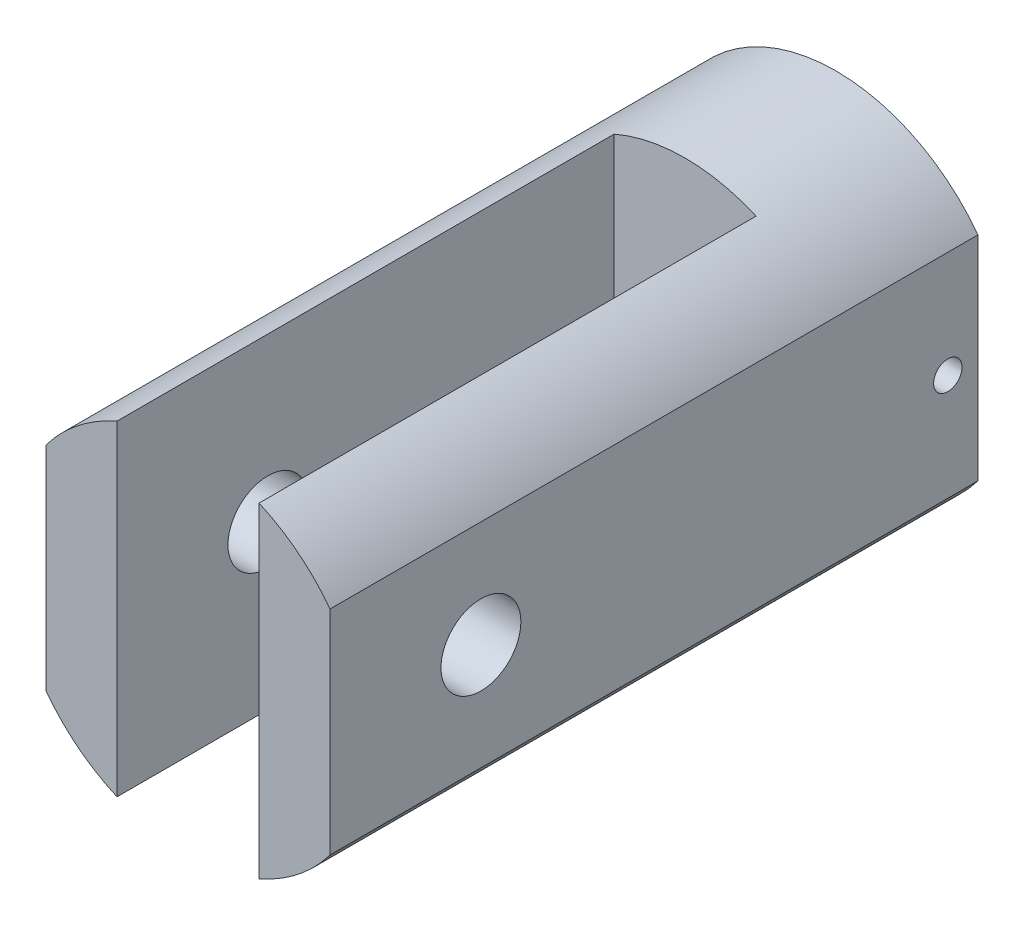
ISO-10303-21;
HEADER;
FILE_DESCRIPTION(('STEP AP214'),'2;1');
FILE_NAME('part.step','',(''),(''),'','','');
FILE_SCHEMA(('AUTOMOTIVE_DESIGN { 1 0 10303 214 1 1 1 1 }'));
ENDSEC;
DATA;
#1=APPLICATION_CONTEXT('core data for automotive mechanical design processes');
#2=APPLICATION_PROTOCOL_DEFINITION('international standard','automotive_design',2000,#1);
#3=PRODUCT_CONTEXT('',#1,'mechanical');
#4=PRODUCT('Part','Part','',(#3));
#5=PRODUCT_RELATED_PRODUCT_CATEGORY('part','',(#4));
#6=PRODUCT_DEFINITION_FORMATION('','',#4);
#7=PRODUCT_DEFINITION_CONTEXT('part definition',#1,'design');
#8=PRODUCT_DEFINITION('design','',#6,#7);
#9=PRODUCT_DEFINITION_SHAPE('','',#8);
#10=(LENGTH_UNIT() NAMED_UNIT(*) SI_UNIT(.MILLI.,.METRE.));
#11=(NAMED_UNIT(*) PLANE_ANGLE_UNIT() SI_UNIT($,.RADIAN.));
#12=(NAMED_UNIT(*) SI_UNIT($,.STERADIAN.) SOLID_ANGLE_UNIT());
#13=UNCERTAINTY_MEASURE_WITH_UNIT(LENGTH_MEASURE(1.E-05),#10,'distance_accuracy_value','');
#14=(GEOMETRIC_REPRESENTATION_CONTEXT(3) GLOBAL_UNCERTAINTY_ASSIGNED_CONTEXT((#13)) GLOBAL_UNIT_ASSIGNED_CONTEXT((#10,
#11,#12)) REPRESENTATION_CONTEXT('',''));
#15=CARTESIAN_POINT('',(0.,0.,0.));
#16=DIRECTION('',(0.,0.,1.));
#17=DIRECTION('',(1.,0.,0.));
#18=AXIS2_PLACEMENT_3D('',#15,#16,#17);
#19=CARTESIAN_POINT('',(0.,0.,36.5));
#20=DIRECTION('',(0.,0.,-1.));
#21=DIRECTION('',(-1.,0.,0.));
#22=AXIS2_PLACEMENT_3D('',#19,#20,#21);
#23=CYLINDRICAL_SURFACE('',#22,10.);
#24=CARTESIAN_POINT('',(0.,0.,36.5));
#25=DIRECTION('',(0.,0.,1.));
#26=DIRECTION('',(1.,0.,0.));
#27=AXIS2_PLACEMENT_3D('',#24,#25,#26);
#28=CIRCLE('',#27,10.);
#29=CARTESIAN_POINT('',(8.00000000000001,5.99999999999999,36.5));
#30=VERTEX_POINT('',#29);
#31=CARTESIAN_POINT('',(4.,9.16515138991168,36.5));
#32=VERTEX_POINT('',#31);
#33=EDGE_CURVE('E127',#30,#32,#28,.T.);
#34=ORIENTED_EDGE('',*,*,#33,.F.);
#35=DIRECTION('',(0.,0.,-1.));
#36=VECTOR('',#35,1.);
#37=CARTESIAN_POINT('',(8.00000000000001,5.99999999999999,36.5));
#38=LINE('',#37,#36);
#39=CARTESIAN_POINT('',(8.,6.,0.));
#40=VERTEX_POINT('',#39);
#41=EDGE_CURVE('E107',#30,#40,#38,.T.);
#42=ORIENTED_EDGE('',*,*,#41,.T.);
#43=CARTESIAN_POINT('',(0.,0.,0.));
#44=DIRECTION('',(0.,0.,1.));
#45=DIRECTION('',(1.,0.,0.));
#46=AXIS2_PLACEMENT_3D('',#43,#44,#45);
#47=CIRCLE('',#46,10.);
#48=CARTESIAN_POINT('',(-8.,6.,0.));
#49=VERTEX_POINT('',#48);
#50=EDGE_CURVE('E63',#40,#49,#47,.T.);
#51=ORIENTED_EDGE('',*,*,#50,.T.);
#52=DIRECTION('',(0.,0.,-1.));
#53=VECTOR('',#52,1.);
#54=CARTESIAN_POINT('',(-8.,6.00000000000001,36.5));
#55=LINE('',#54,#53);
#56=CARTESIAN_POINT('',(-8.,6.00000000000001,36.5));
#57=VERTEX_POINT('',#56);
#58=EDGE_CURVE('E232',#49,#57,#55,.F.);
#59=ORIENTED_EDGE('',*,*,#58,.T.);
#60=CARTESIAN_POINT('',(-4.,9.16515138991168,36.5));
#61=VERTEX_POINT('',#60);
#62=EDGE_CURVE('E129',#61,#57,#28,.T.);
#63=ORIENTED_EDGE('',*,*,#62,.F.);
#64=DIRECTION('',(0.,0.,-1.));
#65=VECTOR('',#64,1.);
#66=CARTESIAN_POINT('',(-4.,9.16515138991168,36.5));
#67=LINE('',#66,#65);
#68=CARTESIAN_POINT('',(-4.,9.16515138991168,8.5));
#69=VERTEX_POINT('',#68);
#70=EDGE_CURVE('E244',#61,#69,#67,.T.);
#71=ORIENTED_EDGE('',*,*,#70,.T.);
#72=CARTESIAN_POINT('',(0.,0.,8.5));
#73=DIRECTION('',(0.,0.,-1.));
#74=DIRECTION('',(-1.,0.,0.));
#75=AXIS2_PLACEMENT_3D('',#72,#73,#74);
#76=CIRCLE('',#75,10.);
#77=CARTESIAN_POINT('',(4.,9.16515138991168,8.49999999999999));
#78=VERTEX_POINT('',#77);
#79=EDGE_CURVE('E142',#69,#78,#76,.T.);
#80=ORIENTED_EDGE('',*,*,#79,.T.);
#81=DIRECTION('',(0.,0.,-1.));
#82=VECTOR('',#81,1.);
#83=CARTESIAN_POINT('',(4.,9.16515138991168,36.5));
#84=LINE('',#83,#82);
#85=EDGE_CURVE('E247',#78,#32,#84,.F.);
#86=ORIENTED_EDGE('',*,*,#85,.T.);
#87=EDGE_LOOP('',(#34,#42,#51,#59,#63,#71,#80,#86));
#88=FACE_BOUND('',#87,.T.);
#89=ADVANCED_FACE('F35',(#88),#23,.T.);
#90=CARTESIAN_POINT('',(0.,0.,36.5));
#91=DIRECTION('',(0.,0.,1.));
#92=DIRECTION('',(1.,0.,0.));
#93=AXIS2_PLACEMENT_3D('',#90,#91,#92);
#94=PLANE('',#93);
#95=DIRECTION('',(0.,1.,0.));
#96=VECTOR('',#95,1.);
#97=CARTESIAN_POINT('',(8.00000000000001,-10.,36.5));
#98=LINE('',#97,#96);
#99=CARTESIAN_POINT('',(8.00000000000001,-5.99999999999999,36.5));
#100=VERTEX_POINT('',#99);
#101=EDGE_CURVE('E105',#100,#30,#98,.T.);
#102=ORIENTED_EDGE('',*,*,#101,.T.);
#103=ORIENTED_EDGE('',*,*,#33,.T.);
#104=DIRECTION('',(0.,1.,0.));
#105=VECTOR('',#104,1.);
#106=CARTESIAN_POINT('',(4.,0.,36.5));
#107=LINE('',#106,#105);
#108=CARTESIAN_POINT('',(4.,-9.16515138991168,36.5));
#109=VERTEX_POINT('',#108);
#110=EDGE_CURVE('E125',#109,#32,#107,.T.);
#111=ORIENTED_EDGE('',*,*,#110,.F.);
#112=EDGE_CURVE('E117',#109,#100,#28,.T.);
#113=ORIENTED_EDGE('',*,*,#112,.T.);
#114=EDGE_LOOP('',(#102,#103,#111,#113));
#115=FACE_BOUND('',#114,.T.);
#116=ADVANCED_FACE('F123',(#115),#94,.T.);
#117=CARTESIAN_POINT('',(-8.,-6.,0.));
#118=VERTEX_POINT('',#117);
#119=CARTESIAN_POINT('',(8.,-6.,0.));
#120=VERTEX_POINT('',#119);
#121=EDGE_CURVE('E120',#118,#120,#47,.T.);
#122=ORIENTED_EDGE('',*,*,#121,.T.);
#123=DIRECTION('',(0.,0.,-1.));
#124=VECTOR('',#123,1.);
#125=CARTESIAN_POINT('',(8.00000000000001,-5.99999999999999,36.5));
#126=LINE('',#125,#124);
#127=EDGE_CURVE('E56',#120,#100,#126,.F.);
#128=ORIENTED_EDGE('',*,*,#127,.T.);
#129=ORIENTED_EDGE('',*,*,#112,.F.);
#130=DIRECTION('',(0.,0.,-1.));
#131=VECTOR('',#130,1.);
#132=CARTESIAN_POINT('',(4.,-9.16515138991168,36.5));
#133=LINE('',#132,#131);
#134=CARTESIAN_POINT('',(4.,-9.16515138991168,8.49999999999999));
#135=VERTEX_POINT('',#134);
#136=EDGE_CURVE('E249',#109,#135,#133,.T.);
#137=ORIENTED_EDGE('',*,*,#136,.T.);
#138=CARTESIAN_POINT('',(-4.,-9.16515138991168,8.5));
#139=VERTEX_POINT('',#138);
#140=EDGE_CURVE('E147',#135,#139,#76,.T.);
#141=ORIENTED_EDGE('',*,*,#140,.T.);
#142=DIRECTION('',(0.,0.,-1.));
#143=VECTOR('',#142,1.);
#144=CARTESIAN_POINT('',(-4.,-9.16515138991168,36.5));
#145=LINE('',#144,#143);
#146=CARTESIAN_POINT('',(-4.,-9.16515138991168,36.5));
#147=VERTEX_POINT('',#146);
#148=EDGE_CURVE('E240',#139,#147,#145,.F.);
#149=ORIENTED_EDGE('',*,*,#148,.T.);
#150=CARTESIAN_POINT('',(-8.,-6.00000000000001,36.5));
#151=VERTEX_POINT('',#150);
#152=EDGE_CURVE('E126',#151,#147,#28,.T.);
#153=ORIENTED_EDGE('',*,*,#152,.F.);
#154=DIRECTION('',(0.,0.,-1.));
#155=VECTOR('',#154,1.);
#156=CARTESIAN_POINT('',(-8.,-6.00000000000001,36.5));
#157=LINE('',#156,#155);
#158=EDGE_CURVE('E234',#151,#118,#157,.T.);
#159=ORIENTED_EDGE('',*,*,#158,.T.);
#160=EDGE_LOOP('',(#122,#128,#129,#137,#141,#149,#153,#159));
#161=FACE_BOUND('',#160,.T.);
#162=ADVANCED_FACE('F37',(#161),#23,.T.);
#163=DIRECTION('',(0.,1.,0.));
#164=VECTOR('',#163,1.);
#165=CARTESIAN_POINT('',(-8.,-10.,36.5));
#166=LINE('',#165,#164);
#167=EDGE_CURVE('E230',#151,#57,#166,.T.);
#168=ORIENTED_EDGE('',*,*,#167,.F.);
#169=ORIENTED_EDGE('',*,*,#152,.T.);
#170=DIRECTION('',(0.,-1.,0.));
#171=VECTOR('',#170,1.);
#172=CARTESIAN_POINT('',(-4.,0.,36.5));
#173=LINE('',#172,#171);
#174=EDGE_CURVE('E133',#61,#147,#173,.T.);
#175=ORIENTED_EDGE('',*,*,#174,.F.);
#176=ORIENTED_EDGE('',*,*,#62,.T.);
#177=EDGE_LOOP('',(#168,#169,#175,#176));
#178=FACE_BOUND('',#177,.T.);
#179=ADVANCED_FACE('F180',(#178),#94,.T.);
#180=CARTESIAN_POINT('',(0.,0.,0.));
#181=DIRECTION('',(0.,0.,1.));
#182=DIRECTION('',(1.,0.,0.));
#183=AXIS2_PLACEMENT_3D('',#180,#181,#182);
#184=PLANE('',#183);
#185=CARTESIAN_POINT('',(0.,0.,0.));
#186=DIRECTION('',(0.,0.,-1.));
#187=DIRECTION('',(-1.,0.,0.));
#188=AXIS2_PLACEMENT_3D('',#185,#186,#187);
#189=CIRCLE('',#188,2.85);
#190=CARTESIAN_POINT('',(-2.85,0.,0.));
#191=VERTEX_POINT('',#190);
#192=EDGE_CURVE('E261',#191,#191,#189,.T.);
#193=ORIENTED_EDGE('',*,*,#192,.F.);
#194=EDGE_LOOP('',(#193));
#195=FACE_BOUND('',#194,.T.);
#196=ORIENTED_EDGE('',*,*,#50,.F.);
#197=DIRECTION('',(0.,-1.,0.));
#198=VECTOR('',#197,1.);
#199=CARTESIAN_POINT('',(8.,0.,0.));
#200=LINE('',#199,#198);
#201=EDGE_CURVE('E11',#40,#120,#200,.T.);
#202=ORIENTED_EDGE('',*,*,#201,.T.);
#203=ORIENTED_EDGE('',*,*,#121,.F.);
#204=DIRECTION('',(0.,1.,0.));
#205=VECTOR('',#204,1.);
#206=CARTESIAN_POINT('',(-8.,0.,0.));
#207=LINE('',#206,#205);
#208=EDGE_CURVE('E48',#118,#49,#207,.T.);
#209=ORIENTED_EDGE('',*,*,#208,.T.);
#210=EDGE_LOOP('',(#196,#202,#203,#209));
#211=FACE_BOUND('',#210,.T.);
#212=ADVANCED_FACE('F185',(#195,#211),#184,.F.);
#213=CARTESIAN_POINT('',(-4.,-10.,8.5));
#214=DIRECTION('',(0.,0.,-1.));
#215=DIRECTION('',(-1.,0.,0.));
#216=AXIS2_PLACEMENT_3D('',#213,#214,#215);
#217=PLANE('',#216);
#218=DIRECTION('',(0.,1.,0.));
#219=VECTOR('',#218,1.);
#220=CARTESIAN_POINT('',(-4.,-10.,8.5));
#221=LINE('',#220,#219);
#222=EDGE_CURVE('E237',#139,#69,#221,.T.);
#223=ORIENTED_EDGE('',*,*,#222,.F.);
#224=ORIENTED_EDGE('',*,*,#140,.F.);
#225=DIRECTION('',(0.,1.,0.));
#226=VECTOR('',#225,1.);
#227=CARTESIAN_POINT('',(4.,-10.,8.49999999999999));
#228=LINE('',#227,#226);
#229=EDGE_CURVE('E236',#135,#78,#228,.T.);
#230=ORIENTED_EDGE('',*,*,#229,.T.);
#231=ORIENTED_EDGE('',*,*,#79,.F.);
#232=EDGE_LOOP('',(#223,#224,#230,#231));
#233=FACE_BOUND('',#232,.T.);
#234=ADVANCED_FACE('F189',(#233),#217,.F.);
#235=CARTESIAN_POINT('',(4.,-10.,8.49999999999999));
#236=DIRECTION('',(1.,0.,0.));
#237=DIRECTION('',(0.,0.,-1.));
#238=AXIS2_PLACEMENT_3D('',#235,#236,#237);
#239=PLANE('',#238);
#240=CARTESIAN_POINT('',(4.,0.,28.));
#241=DIRECTION('',(1.,0.,0.));
#242=DIRECTION('',(0.,0.,-1.));
#243=AXIS2_PLACEMENT_3D('',#240,#241,#242);
#244=CIRCLE('',#243,2.25);
#245=CARTESIAN_POINT('',(4.,0.,25.75));
#246=VERTEX_POINT('',#245);
#247=EDGE_CURVE('E111',#246,#246,#244,.T.);
#248=ORIENTED_EDGE('',*,*,#247,.T.);
#249=EDGE_LOOP('',(#248));
#250=FACE_BOUND('',#249,.T.);
#251=ORIENTED_EDGE('',*,*,#110,.T.);
#252=ORIENTED_EDGE('',*,*,#85,.F.);
#253=ORIENTED_EDGE('',*,*,#229,.F.);
#254=ORIENTED_EDGE('',*,*,#136,.F.);
#255=EDGE_LOOP('',(#251,#252,#253,#254));
#256=FACE_BOUND('',#255,.T.);
#257=ADVANCED_FACE('F192',(#250,#256),#239,.F.);
#258=CARTESIAN_POINT('',(-4.,-10.,8.5));
#259=DIRECTION('',(-1.,0.,0.));
#260=DIRECTION('',(0.,0.,1.));
#261=AXIS2_PLACEMENT_3D('',#258,#259,#260);
#262=PLANE('',#261);
#263=CARTESIAN_POINT('',(-4.,0.,28.));
#264=DIRECTION('',(-1.,0.,0.));
#265=DIRECTION('',(0.,0.,1.));
#266=AXIS2_PLACEMENT_3D('',#263,#264,#265);
#267=CIRCLE('',#266,2.25);
#268=CARTESIAN_POINT('',(-4.,0.,30.25));
#269=VERTEX_POINT('',#268);
#270=EDGE_CURVE('E222',#269,#269,#267,.T.);
#271=ORIENTED_EDGE('',*,*,#270,.T.);
#272=EDGE_LOOP('',(#271));
#273=FACE_BOUND('',#272,.T.);
#274=ORIENTED_EDGE('',*,*,#174,.T.);
#275=ORIENTED_EDGE('',*,*,#148,.F.);
#276=ORIENTED_EDGE('',*,*,#222,.T.);
#277=ORIENTED_EDGE('',*,*,#70,.F.);
#278=EDGE_LOOP('',(#274,#275,#276,#277));
#279=FACE_BOUND('',#278,.T.);
#280=ADVANCED_FACE('F195',(#273,#279),#262,.F.);
#281=CARTESIAN_POINT('',(-8.,-10.,0.));
#282=DIRECTION('',(1.,0.,0.));
#283=DIRECTION('',(0.,0.,-1.));
#284=AXIS2_PLACEMENT_3D('',#281,#282,#283);
#285=PLANE('',#284);
#286=CARTESIAN_POINT('',(-8.,0.,1.7));
#287=DIRECTION('',(-1.,0.,0.));
#288=DIRECTION('',(0.,0.,1.));
#289=AXIS2_PLACEMENT_3D('',#286,#287,#288);
#290=CIRCLE('',#289,0.8);
#291=CARTESIAN_POINT('',(-8.,0.,2.5));
#292=VERTEX_POINT('',#291);
#293=EDGE_CURVE('E265',#292,#292,#290,.T.);
#294=ORIENTED_EDGE('',*,*,#293,.F.);
#295=EDGE_LOOP('',(#294));
#296=FACE_BOUND('',#295,.T.);
#297=CARTESIAN_POINT('',(-8.,0.,28.));
#298=DIRECTION('',(1.,0.,0.));
#299=DIRECTION('',(0.,0.,-1.));
#300=AXIS2_PLACEMENT_3D('',#297,#298,#299);
#301=CIRCLE('',#300,2.25);
#302=CARTESIAN_POINT('',(-8.,0.,25.75));
#303=VERTEX_POINT('',#302);
#304=EDGE_CURVE('E225',#303,#303,#301,.T.);
#305=ORIENTED_EDGE('',*,*,#304,.T.);
#306=EDGE_LOOP('',(#305));
#307=FACE_BOUND('',#306,.T.);
#308=ORIENTED_EDGE('',*,*,#167,.T.);
#309=ORIENTED_EDGE('',*,*,#58,.F.);
#310=ORIENTED_EDGE('',*,*,#208,.F.);
#311=ORIENTED_EDGE('',*,*,#158,.F.);
#312=EDGE_LOOP('',(#308,#309,#310,#311));
#313=FACE_BOUND('',#312,.T.);
#314=ADVANCED_FACE('F202',(#296,#307,#313),#285,.F.);
#315=CARTESIAN_POINT('',(8.,-10.,0.));
#316=DIRECTION('',(-1.,0.,0.));
#317=DIRECTION('',(0.,0.,1.));
#318=AXIS2_PLACEMENT_3D('',#315,#316,#317);
#319=PLANE('',#318);
#320=CARTESIAN_POINT('',(8.00000000000001,0.,1.7));
#321=DIRECTION('',(-1.,0.,0.));
#322=DIRECTION('',(0.,0.,1.));
#323=AXIS2_PLACEMENT_3D('',#320,#321,#322);
#324=CIRCLE('',#323,0.8);
#325=CARTESIAN_POINT('',(8.00000000000001,0.,2.5));
#326=VERTEX_POINT('',#325);
#327=EDGE_CURVE('E153',#326,#326,#324,.T.);
#328=ORIENTED_EDGE('',*,*,#327,.T.);
#329=EDGE_LOOP('',(#328));
#330=FACE_BOUND('',#329,.T.);
#331=CARTESIAN_POINT('',(8.00000000000001,0.,28.));
#332=DIRECTION('',(1.,0.,0.));
#333=DIRECTION('',(0.,0.,-1.));
#334=AXIS2_PLACEMENT_3D('',#331,#332,#333);
#335=CIRCLE('',#334,2.25);
#336=CARTESIAN_POINT('',(8.00000000000001,0.,25.75));
#337=VERTEX_POINT('',#336);
#338=EDGE_CURVE('E219',#337,#337,#335,.T.);
#339=ORIENTED_EDGE('',*,*,#338,.F.);
#340=EDGE_LOOP('',(#339));
#341=FACE_BOUND('',#340,.T.);
#342=ORIENTED_EDGE('',*,*,#101,.F.);
#343=ORIENTED_EDGE('',*,*,#127,.F.);
#344=ORIENTED_EDGE('',*,*,#201,.F.);
#345=ORIENTED_EDGE('',*,*,#41,.F.);
#346=EDGE_LOOP('',(#342,#343,#344,#345));
#347=FACE_BOUND('',#346,.T.);
#348=ADVANCED_FACE('F106',(#330,#341,#347),#319,.F.);
#349=CARTESIAN_POINT('',(-8.,0.,28.));
#350=DIRECTION('',(1.,0.,0.));
#351=DIRECTION('',(0.,0.,-1.));
#352=AXIS2_PLACEMENT_3D('',#349,#350,#351);
#353=CYLINDRICAL_SURFACE('',#352,2.25);
#354=ORIENTED_EDGE('',*,*,#338,.T.);
#355=EDGE_LOOP('',(#354));
#356=FACE_BOUND('',#355,.T.);
#357=ORIENTED_EDGE('',*,*,#247,.F.);
#358=EDGE_LOOP('',(#357));
#359=FACE_BOUND('',#358,.T.);
#360=ADVANCED_FACE('F208',(#356,#359),#353,.F.);
#361=ORIENTED_EDGE('',*,*,#304,.F.);
#362=EDGE_LOOP('',(#361));
#363=FACE_BOUND('',#362,.T.);
#364=ORIENTED_EDGE('',*,*,#270,.F.);
#365=EDGE_LOOP('',(#364));
#366=FACE_BOUND('',#365,.T.);
#367=ADVANCED_FACE('F172',(#363,#366),#353,.F.);
#368=CARTESIAN_POINT('',(0.,0.,3.8));
#369=DIRECTION('',(0.,0.,-1.));
#370=DIRECTION('',(-1.,0.,0.));
#371=AXIS2_PLACEMENT_3D('',#368,#369,#370);
#372=CYLINDRICAL_SURFACE('',#371,2.85);
#373=CARTESIAN_POINT('',(-2.85,0.,2.5));
#374=CARTESIAN_POINT('',(-2.84999943440691,0.0440142185350792,2.4999991472256));
#375=CARTESIAN_POINT('',(-2.84897047471691,0.0880372914127955,2.49635552422548));
#376=CARTESIAN_POINT('',(-2.84496590767905,0.17480957599527,2.48190666105973));
#377=CARTESIAN_POINT('',(-2.84198951007227,0.217558263195526,2.47109851354864));
#378=CARTESIAN_POINT('',(-2.83441761738066,0.300517139775411,2.44270394378503));
#379=CARTESIAN_POINT('',(-2.829824335115,0.340730710394852,2.42512678232395));
#380=CARTESIAN_POINT('',(-2.81950080548073,0.417639552962544,2.38372897460041));
#381=CARTESIAN_POINT('',(-2.81377045054328,0.454334491555271,2.35990773757029));
#382=CARTESIAN_POINT('',(-2.80162528783942,0.524098648568391,2.30605813197358));
#383=CARTESIAN_POINT('',(-2.7951978079715,0.557065554721843,2.27590007354776));
#384=CARTESIAN_POINT('',(-2.78246177086238,0.617546561457283,2.21050978310805));
#385=CARTESIAN_POINT('',(-2.77615323086643,0.645059876734844,2.17527682157933));
#386=CARTESIAN_POINT('',(-2.76423796230357,0.694367516303863,2.09990028850307));
#387=CARTESIAN_POINT('',(-2.75864712709805,0.716041226159381,2.0596750716191));
#388=CARTESIAN_POINT('',(-2.74898787558308,0.752276409636693,1.97596894893513));
#389=CARTESIAN_POINT('',(-2.74491914455181,0.766839353724722,1.93248871840032));
#390=CARTESIAN_POINT('',(-2.73889611368771,0.788078724404868,1.84464662355717));
#391=CARTESIAN_POINT('',(-2.7368918308357,0.794941957977528,1.80033344142513));
#392=CARTESIAN_POINT('',(-2.73507554523361,0.801169895336155,1.71114279854383));
#393=CARTESIAN_POINT('',(-2.73526308436641,0.800536166077056,1.66626545766925));
#394=CARTESIAN_POINT('',(-2.73776469545849,0.79193582457135,1.57870279089443));
#395=CARTESIAN_POINT('',(-2.74001228938712,0.784198434668038,1.53599274465844));
#396=CARTESIAN_POINT('',(-2.74627386947214,0.761978847231074,1.45250292604994));
#397=CARTESIAN_POINT('',(-2.75028801033529,0.74749605895728,1.41172332308404));
#398=CARTESIAN_POINT('',(-2.75968661542562,0.712017431445086,1.33266958331158));
#399=CARTESIAN_POINT('',(-2.76508731955715,0.690943710419622,1.29443241183702));
#400=CARTESIAN_POINT('',(-2.7766421782743,0.642935659178007,1.22195804332509));
#401=CARTESIAN_POINT('',(-2.78279649530743,0.616000064410433,1.18772171182119));
#402=CARTESIAN_POINT('',(-2.79543898131276,0.555874510542056,1.12291497219811));
#403=CARTESIAN_POINT('',(-2.80193115817125,0.522492955367642,1.09252282927434));
#404=CARTESIAN_POINT('',(-2.8143184303934,0.451026720336942,1.03772938434496));
#405=CARTESIAN_POINT('',(-2.82021349690836,0.412941813440636,1.01332837171299));
#406=CARTESIAN_POINT('',(-2.83078534817397,0.332854455332113,0.971119448228274));
#407=CARTESIAN_POINT('',(-2.83545558729225,0.290832521986011,0.953346755069884));
#408=CARTESIAN_POINT('',(-2.84300438300157,0.204235521423521,0.925171193450195));
#409=CARTESIAN_POINT('',(-2.84588337490913,0.159661077407003,0.914766534292878));
#410=CARTESIAN_POINT('',(-2.84945821873937,0.0707432871352404,0.901909143122414));
#411=CARTESIAN_POINT('',(-2.85022049825331,0.0264375569771178,0.899214370927365));
#412=CARTESIAN_POINT('',(-2.8496686016001,-0.0619938435945519,0.901180755802838));
#413=CARTESIAN_POINT('',(-2.84835466519149,-0.106119534208885,0.90584106351885));
#414=CARTESIAN_POINT('',(-2.84384113935468,-0.19205416178238,0.922187833990808));
#415=CARTESIAN_POINT('',(-2.84067850884599,-0.233891399841366,0.933736671765043));
#416=CARTESIAN_POINT('',(-2.8328289434148,-0.315028621428461,0.963370514228761));
#417=CARTESIAN_POINT('',(-2.82814183494309,-0.354328315467368,0.981456263117631));
#418=CARTESIAN_POINT('',(-2.81761087664633,-0.430195118576563,1.02408189975103));
#419=CARTESIAN_POINT('',(-2.81174469374777,-0.466687015879377,1.04874999251891));
#420=CARTESIAN_POINT('',(-2.79953216492614,-0.535097400266051,1.10368117814784));
#421=CARTESIAN_POINT('',(-2.79318571380152,-0.567014880878585,1.13394549895663));
#422=CARTESIAN_POINT('',(-2.78047907359481,-0.626409530653941,1.20034344773553));
#423=CARTESIAN_POINT('',(-2.77412474463454,-0.653715233392042,1.23663188395065));
#424=CARTESIAN_POINT('',(-2.76233846409789,-0.701856652904311,1.31341231654359));
#425=CARTESIAN_POINT('',(-2.7569064783289,-0.722692609545084,1.3539041570054));
#426=CARTESIAN_POINT('',(-2.74764332263367,-0.757149096603172,1.43776320787246));
#427=CARTESIAN_POINT('',(-2.74380342789477,-0.770809065307915,1.48111319631311));
#428=CARTESIAN_POINT('',(-2.73816567416793,-0.7906052850795,1.56962296763665));
#429=CARTESIAN_POINT('',(-2.73636722312803,-0.796743717555612,1.61478222186741));
#430=CARTESIAN_POINT('',(-2.73506914740952,-0.8011874737792,1.70386300420325));
#431=CARTESIAN_POINT('',(-2.73548819485483,-0.799769903549849,1.74776971967281));
#432=CARTESIAN_POINT('',(-2.73838538767777,-0.789792303810679,1.83469120475425));
#433=CARTESIAN_POINT('',(-2.74086346875749,-0.781232497333089,1.87770600217526));
#434=CARTESIAN_POINT('',(-2.74754850918269,-0.757381817808649,1.96123151823404));
#435=CARTESIAN_POINT('',(-2.75173882666703,-0.742155638625161,2.00176213771276));
#436=CARTESIAN_POINT('',(-2.76137508638442,-0.705454454851662,2.07972521912881));
#437=CARTESIAN_POINT('',(-2.76682124426607,-0.683978376884321,2.11715714746758));
#438=CARTESIAN_POINT('',(-2.7785754198242,-0.634572484717531,2.18916815393184));
#439=CARTESIAN_POINT('',(-2.78490560958382,-0.606456462307192,2.2236158678804));
#440=CARTESIAN_POINT('',(-2.79759771795907,-0.544915153256429,2.28739421448562));
#441=CARTESIAN_POINT('',(-2.80395964409098,-0.511488544820349,2.31672356936774));
#442=CARTESIAN_POINT('',(-2.81618485749111,-0.43928822946094,2.37014265832639));
#443=CARTESIAN_POINT('',(-2.82203212755214,-0.400403666241321,2.39408656663836));
#444=CARTESIAN_POINT('',(-2.83238759583654,-0.31899719452972,2.43506087294631));
#445=CARTESIAN_POINT('',(-2.83689656032514,-0.276477385482051,2.45209522915766));
#446=CARTESIAN_POINT('',(-2.8435603886624,-0.195164384603046,2.47682422679381));
#447=CARTESIAN_POINT('',(-2.8459567086479,-0.156684790126666,2.48549363412117));
#448=CARTESIAN_POINT('',(-2.84917667030811,-0.0788057533867301,2.49708154703782));
#449=CARTESIAN_POINT('',(-2.85000050638187,-0.0394064254353183,2.50000076349852));
#450=CARTESIAN_POINT('',(-2.85,0.,2.5));
#451=B_SPLINE_CURVE_WITH_KNOTS('',3,(#373,#374,#375,#376,#377,#378,#379,#380,#381,#382,#383,
#384,#385,#386,#387,#388,#389,#390,#391,#392,#393,#394,#395,#396,#397,#398,#399,#400,#401,#402,
#403,#404,#405,#406,#407,#408,#409,#410,#411,#412,#413,#414,#415,#416,#417,#418,#419,#420,#421,
#422,#423,#424,#425,#426,#427,#428,#429,#430,#431,#432,#433,#434,#435,#436,#437,#438,#439,#440,
#441,#442,#443,#444,#445,#446,#447,#448,#449,#450),.UNSPECIFIED.,.T.,.F.,(4,2,2,2,2,2,2,2,2,2,2,
2,2,2,2,2,2,2,2,2,2,2,2,2,2,2,2,2,2,2,2,2,2,2,2,2,2,2,4),(0.,0.131898047333058,
0.263849651344393,0.395621368028568,0.527405556468343,0.662208598221783,0.797031037221142,
0.934455340031981,1.07185121222403,1.2058362502252,1.33979328424517,1.46957413855663,
1.59936636079277,1.73075423390338,1.86217047877983,1.99835882744166,2.13455375275395,
2.27146233644821,2.40833763502553,2.54086610958474,2.67337928105778,2.80332972093841,
2.93329495978344,3.06600417003822,3.19874253453173,3.3356606449573,3.47257367852137,
3.60872616898169,3.74483916290196,3.87599554224044,4.00714782608225,4.1370546158629,
4.26698372942523,4.40111361375641,4.53527693523679,4.67272424588587,4.81009270670146,
4.9281971152509,5.04628692214255),.UNSPECIFIED.);
#452=CARTESIAN_POINT('',(-2.85,0.,2.5));
#453=VERTEX_POINT('',#452);
#454=EDGE_CURVE('E39',#453,#453,#451,.T.);
#455=ORIENTED_EDGE('',*,*,#454,.T.);
#456=EDGE_LOOP('',(#455));
#457=FACE_BOUND('',#456,.T.);
#458=CARTESIAN_POINT('',(2.85,0.,2.5));
#459=CARTESIAN_POINT('',(2.8499994344069,-0.0440142185350793,2.4999991472256));
#460=CARTESIAN_POINT('',(2.84897047471691,-0.0880372914127957,2.49635552422548));
#461=CARTESIAN_POINT('',(2.84496590767905,-0.174809575995271,2.48190666105973));
#462=CARTESIAN_POINT('',(2.84198951007228,-0.217558263195526,2.47109851354864));
#463=CARTESIAN_POINT('',(2.83441761738066,-0.300517139775411,2.44270394378503));
#464=CARTESIAN_POINT('',(2.829824335115,-0.340730710394852,2.42512678232395));
#465=CARTESIAN_POINT('',(2.81950080548073,-0.417639552962544,2.38372897460041));
#466=CARTESIAN_POINT('',(2.81377045054328,-0.454334491555271,2.35990773757029));
#467=CARTESIAN_POINT('',(2.80162528783942,-0.524098648568391,2.30605813197358));
#468=CARTESIAN_POINT('',(2.7951978079715,-0.557065554721843,2.27590007354776));
#469=CARTESIAN_POINT('',(2.78246177086238,-0.617546561457284,2.21050978310805));
#470=CARTESIAN_POINT('',(2.77615323086643,-0.645059876734844,2.17527682157933));
#471=CARTESIAN_POINT('',(2.76423796230357,-0.694367516303864,2.09990028850307));
#472=CARTESIAN_POINT('',(2.75864712709805,-0.716041226159381,2.05967507161909));
#473=CARTESIAN_POINT('',(2.74898787558308,-0.752276409636693,1.97596894893513));
#474=CARTESIAN_POINT('',(2.74491914455181,-0.766839353724723,1.93248871840032));
#475=CARTESIAN_POINT('',(2.73889611368771,-0.788078724404868,1.84464662355716));
#476=CARTESIAN_POINT('',(2.7368918308357,-0.794941957977528,1.80033344142513));
#477=CARTESIAN_POINT('',(2.73507554523361,-0.801169895336155,1.71114279854383));
#478=CARTESIAN_POINT('',(2.73526308436641,-0.800536166077056,1.66626545766925));
#479=CARTESIAN_POINT('',(2.73776469545849,-0.79193582457135,1.57870279089443));
#480=CARTESIAN_POINT('',(2.74001228938712,-0.784198434668038,1.53599274465844));
#481=CARTESIAN_POINT('',(2.74627386947214,-0.761978847231074,1.45250292604994));
#482=CARTESIAN_POINT('',(2.75028801033529,-0.747496058957279,1.41172332308404));
#483=CARTESIAN_POINT('',(2.75968661542562,-0.712017431445086,1.33266958331158));
#484=CARTESIAN_POINT('',(2.76508731955715,-0.690943710419622,1.29443241183702));
#485=CARTESIAN_POINT('',(2.7766421782743,-0.642935659178007,1.22195804332509));
#486=CARTESIAN_POINT('',(2.78279649530743,-0.616000064410433,1.18772171182119));
#487=CARTESIAN_POINT('',(2.79543898131276,-0.555874510542056,1.12291497219811));
#488=CARTESIAN_POINT('',(2.80193115817125,-0.522492955367642,1.09252282927434));
#489=CARTESIAN_POINT('',(2.8143184303934,-0.451026720336942,1.03772938434496));
#490=CARTESIAN_POINT('',(2.82021349690836,-0.412941813440636,1.01332837171299));
#491=CARTESIAN_POINT('',(2.83078534817397,-0.332854455332113,0.971119448228273));
#492=CARTESIAN_POINT('',(2.83545558729225,-0.290832521986011,0.953346755069883));
#493=CARTESIAN_POINT('',(2.84300438300157,-0.204235521423521,0.925171193450195));
#494=CARTESIAN_POINT('',(2.84588337490913,-0.159661077407003,0.914766534292877));
#495=CARTESIAN_POINT('',(2.84945821873937,-0.0707432871352402,0.901909143122414));
#496=CARTESIAN_POINT('',(2.85022049825331,-0.0264375569771174,0.899214370927364));
#497=CARTESIAN_POINT('',(2.8496686016001,0.0619938435945523,0.901180755802837));
#498=CARTESIAN_POINT('',(2.84835466519149,0.106119534208885,0.90584106351885));
#499=CARTESIAN_POINT('',(2.84384113935468,0.19205416178238,0.922187833990807));
#500=CARTESIAN_POINT('',(2.84067850884599,0.233891399841366,0.933736671765042));
#501=CARTESIAN_POINT('',(2.8328289434148,0.31502862142846,0.96337051422876));
#502=CARTESIAN_POINT('',(2.82814183494309,0.354328315467368,0.98145626311763));
#503=CARTESIAN_POINT('',(2.81761087664633,0.430195118576563,1.02408189975102));
#504=CARTESIAN_POINT('',(2.81174469374777,0.466687015879377,1.04874999251891));
#505=CARTESIAN_POINT('',(2.79953216492614,0.535097400266051,1.10368117814784));
#506=CARTESIAN_POINT('',(2.79318571380152,0.567014880878585,1.13394549895662));
#507=CARTESIAN_POINT('',(2.78047907359481,0.626409530653941,1.20034344773553));
#508=CARTESIAN_POINT('',(2.77412474463454,0.653715233392042,1.23663188395065));
#509=CARTESIAN_POINT('',(2.76233846409789,0.70185665290431,1.31341231654359));
#510=CARTESIAN_POINT('',(2.7569064783289,0.722692609545084,1.3539041570054));
#511=CARTESIAN_POINT('',(2.74764332263367,0.757149096603172,1.43776320787246));
#512=CARTESIAN_POINT('',(2.74380342789477,0.770809065307915,1.48111319631311));
#513=CARTESIAN_POINT('',(2.73816567416793,0.7906052850795,1.56962296763665));
#514=CARTESIAN_POINT('',(2.73636722312803,0.796743717555612,1.61478222186741));
#515=CARTESIAN_POINT('',(2.73506914740952,0.8011874737792,1.70386300420325));
#516=CARTESIAN_POINT('',(2.73548819485483,0.799769903549849,1.74776971967281));
#517=CARTESIAN_POINT('',(2.73838538767777,0.789792303810679,1.83469120475425));
#518=CARTESIAN_POINT('',(2.74086346875749,0.781232497333089,1.87770600217526));
#519=CARTESIAN_POINT('',(2.74754850918269,0.757381817808649,1.96123151823404));
#520=CARTESIAN_POINT('',(2.75173882666703,0.742155638625161,2.00176213771275));
#521=CARTESIAN_POINT('',(2.76137508638442,0.705454454851662,2.07972521912881));
#522=CARTESIAN_POINT('',(2.76682124426607,0.683978376884321,2.11715714746757));
#523=CARTESIAN_POINT('',(2.7785754198242,0.634572484717531,2.18916815393184));
#524=CARTESIAN_POINT('',(2.78490560958382,0.606456462307192,2.2236158678804));
#525=CARTESIAN_POINT('',(2.79759771795907,0.544915153256429,2.28739421448562));
#526=CARTESIAN_POINT('',(2.80395964409098,0.511488544820349,2.31672356936774));
#527=CARTESIAN_POINT('',(2.81618485749111,0.43928822946094,2.37014265832639));
#528=CARTESIAN_POINT('',(2.82203212755214,0.400403666241322,2.39408656663836));
#529=CARTESIAN_POINT('',(2.83238759583654,0.318997194529721,2.43506087294631));
#530=CARTESIAN_POINT('',(2.83689656032514,0.276477385482052,2.45209522915766));
#531=CARTESIAN_POINT('',(2.8435603886624,0.195164384603046,2.47682422679381));
#532=CARTESIAN_POINT('',(2.8459567086479,0.156684790126665,2.48549363412117));
#533=CARTESIAN_POINT('',(2.84917667030811,0.0788057533867297,2.49708154703782));
#534=CARTESIAN_POINT('',(2.85000050638186,0.0394064254353182,2.50000076349852));
#535=CARTESIAN_POINT('',(2.85,0.,2.5));
#536=B_SPLINE_CURVE_WITH_KNOTS('',3,(#458,#459,#460,#461,#462,#463,#464,#465,#466,#467,#468,
#469,#470,#471,#472,#473,#474,#475,#476,#477,#478,#479,#480,#481,#482,#483,#484,#485,#486,#487,
#488,#489,#490,#491,#492,#493,#494,#495,#496,#497,#498,#499,#500,#501,#502,#503,#504,#505,#506,
#507,#508,#509,#510,#511,#512,#513,#514,#515,#516,#517,#518,#519,#520,#521,#522,#523,#524,#525,
#526,#527,#528,#529,#530,#531,#532,#533,#534,#535),.UNSPECIFIED.,.T.,.F.,(4,2,2,2,2,2,2,2,2,2,2,
2,2,2,2,2,2,2,2,2,2,2,2,2,2,2,2,2,2,2,2,2,2,2,2,2,2,2,4),(0.,0.131898047333058,
0.263849651344393,0.395621368028568,0.527405556468343,0.662208598221784,0.797031037221143,
0.934455340031981,1.07185121222403,1.2058362502252,1.33979328424517,1.46957413855663,
1.59936636079277,1.73075423390338,1.86217047877983,1.99835882744166,2.13455375275395,
2.27146233644821,2.40833763502553,2.54086610958474,2.67337928105778,2.80332972093841,
2.93329495978344,3.06600417003822,3.19874253453173,3.3356606449573,3.47257367852137,
3.60872616898169,3.74483916290196,3.87599554224044,4.00714782608225,4.1370546158629,
4.26698372942523,4.40111361375641,4.53527693523679,4.67272424588587,4.81009270670146,
4.9281971152509,5.04628692214255),.UNSPECIFIED.);
#537=CARTESIAN_POINT('',(2.85,0.,2.5));
#538=VERTEX_POINT('',#537);
#539=EDGE_CURVE('E149',#538,#538,#536,.T.);
#540=ORIENTED_EDGE('',*,*,#539,.T.);
#541=EDGE_LOOP('',(#540));
#542=FACE_BOUND('',#541,.T.);
#543=CARTESIAN_POINT('',(0.,0.,3.8));
#544=DIRECTION('',(0.,0.,-1.));
#545=DIRECTION('',(-1.,0.,0.));
#546=AXIS2_PLACEMENT_3D('',#543,#544,#545);
#547=CIRCLE('',#546,2.85);
#548=CARTESIAN_POINT('',(-2.85,0.,3.8));
#549=VERTEX_POINT('',#548);
#550=EDGE_CURVE('E260',#549,#549,#547,.T.);
#551=ORIENTED_EDGE('',*,*,#550,.F.);
#552=EDGE_LOOP('',(#551));
#553=FACE_BOUND('',#552,.T.);
#554=ORIENTED_EDGE('',*,*,#192,.T.);
#555=EDGE_LOOP('',(#554));
#556=FACE_BOUND('',#555,.T.);
#557=ADVANCED_FACE('F154',(#457,#542,#553,#556),#372,.F.);
#558=CARTESIAN_POINT('',(0.,0.,3.8));
#559=DIRECTION('',(0.,0.,-1.));
#560=DIRECTION('',(-1.,0.,0.));
#561=AXIS2_PLACEMENT_3D('',#558,#559,#560);
#562=PLANE('',#561);
#563=ORIENTED_EDGE('',*,*,#550,.T.);
#564=EDGE_LOOP('',(#563));
#565=FACE_BOUND('',#564,.T.);
#566=ADVANCED_FACE('F163',(#565),#562,.T.);
#567=CARTESIAN_POINT('',(8.00000000000001,0.,1.7));
#568=DIRECTION('',(-1.,0.,0.));
#569=DIRECTION('',(0.,0.,1.));
#570=AXIS2_PLACEMENT_3D('',#567,#568,#569);
#571=CYLINDRICAL_SURFACE('',#570,0.8);
#572=ORIENTED_EDGE('',*,*,#327,.F.);
#573=EDGE_LOOP('',(#572));
#574=FACE_BOUND('',#573,.T.);
#575=ORIENTED_EDGE('',*,*,#539,.F.);
#576=EDGE_LOOP('',(#575));
#577=FACE_BOUND('',#576,.T.);
#578=ADVANCED_FACE('F161',(#574,#577),#571,.F.);
#579=ORIENTED_EDGE('',*,*,#293,.T.);
#580=EDGE_LOOP('',(#579));
#581=FACE_BOUND('',#580,.T.);
#582=ORIENTED_EDGE('',*,*,#454,.F.);
#583=EDGE_LOOP('',(#582));
#584=FACE_BOUND('',#583,.T.);
#585=ADVANCED_FACE('F158',(#581,#584),#571,.F.);
#586=CLOSED_SHELL('',(#89,#116,#162,#179,#212,#234,#257,#280,#314,#348,#360,#367,#557,#566,#578,#585));
#587=MANIFOLD_SOLID_BREP('B2',#586);
#588=ADVANCED_BREP_SHAPE_REPRESENTATION('',(#18,#587),#14);
#589=SHAPE_DEFINITION_REPRESENTATION(#9,#588);
ENDSEC;
END-ISO-10303-21;
